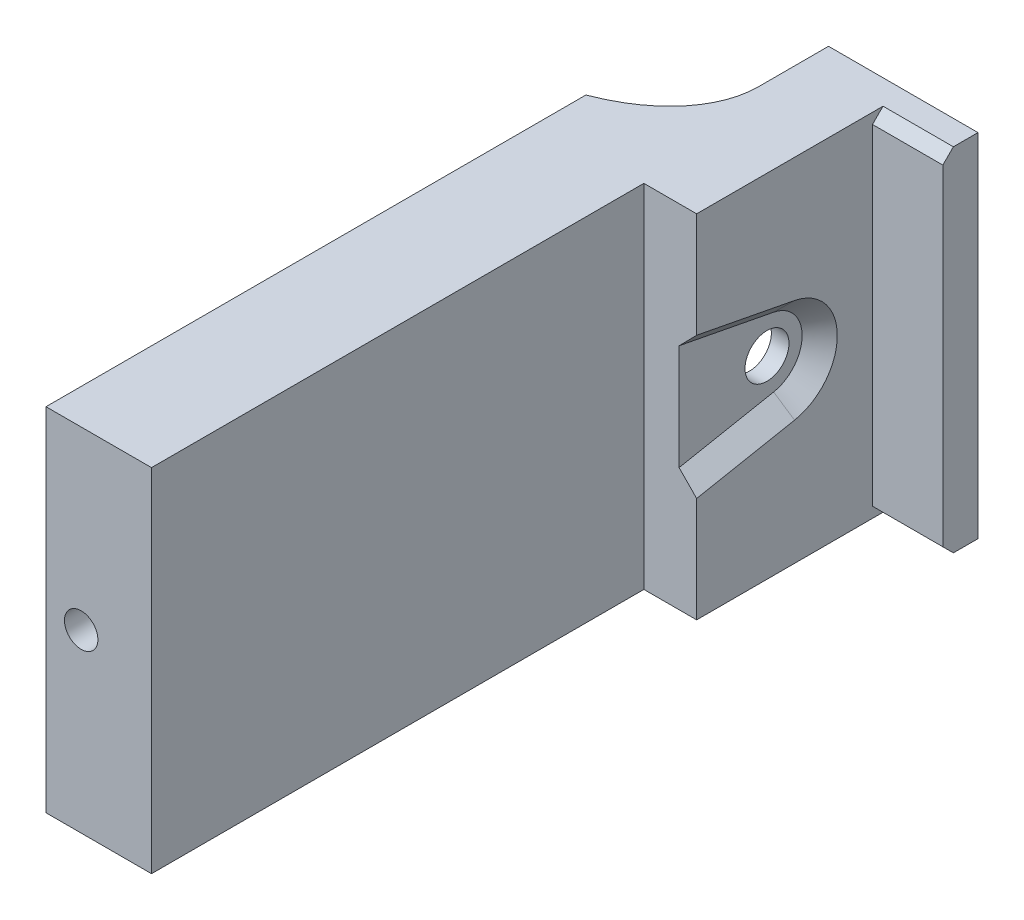
ISO-10303-21;
HEADER;
FILE_DESCRIPTION(('STEP AP214'),'2;1');
FILE_NAME('part.step','',(''),(''),'','','');
FILE_SCHEMA(('AUTOMOTIVE_DESIGN { 1 0 10303 214 1 1 1 1 }'));
ENDSEC;
DATA;
#1=APPLICATION_CONTEXT('core data for automotive mechanical design processes');
#2=APPLICATION_PROTOCOL_DEFINITION('international standard','automotive_design',2000,#1);
#3=PRODUCT_CONTEXT('',#1,'mechanical');
#4=PRODUCT('Part','Part','',(#3));
#5=PRODUCT_RELATED_PRODUCT_CATEGORY('part','',(#4));
#6=PRODUCT_DEFINITION_FORMATION('','',#4);
#7=PRODUCT_DEFINITION_CONTEXT('part definition',#1,'design');
#8=PRODUCT_DEFINITION('design','',#6,#7);
#9=PRODUCT_DEFINITION_SHAPE('','',#8);
#10=(LENGTH_UNIT() NAMED_UNIT(*) SI_UNIT(.MILLI.,.METRE.));
#11=(NAMED_UNIT(*) PLANE_ANGLE_UNIT() SI_UNIT($,.RADIAN.));
#12=(NAMED_UNIT(*) SI_UNIT($,.STERADIAN.) SOLID_ANGLE_UNIT());
#13=UNCERTAINTY_MEASURE_WITH_UNIT(LENGTH_MEASURE(1.E-05),#10,'distance_accuracy_value','');
#14=(GEOMETRIC_REPRESENTATION_CONTEXT(3) GLOBAL_UNCERTAINTY_ASSIGNED_CONTEXT((#13)) GLOBAL_UNIT_ASSIGNED_CONTEXT((#10,
#11,#12)) REPRESENTATION_CONTEXT('',''));
#15=CARTESIAN_POINT('',(0.,0.,0.));
#16=DIRECTION('',(0.,0.,1.));
#17=DIRECTION('',(1.,0.,0.));
#18=AXIS2_PLACEMENT_3D('',#15,#16,#17);
#19=CARTESIAN_POINT('',(16.,0.,-5.));
#20=DIRECTION('',(-1.,0.,0.));
#21=DIRECTION('',(0.,0.,1.));
#22=AXIS2_PLACEMENT_3D('',#19,#20,#21);
#23=CYLINDRICAL_SURFACE('',#22,1.25);
#24=CARTESIAN_POINT('',(1.00000000000001,0.,-5.));
#25=DIRECTION('',(-1.,0.,0.));
#26=DIRECTION('',(0.,0.,1.));
#27=AXIS2_PLACEMENT_3D('',#24,#25,#26);
#28=CIRCLE('',#27,1.25);
#29=CARTESIAN_POINT('',(1.00000000000001,0.,-3.75));
#30=VERTEX_POINT('',#29);
#31=EDGE_CURVE('E313',#30,#30,#28,.T.);
#32=ORIENTED_EDGE('',*,*,#31,.T.);
#33=EDGE_LOOP('',(#32));
#34=FACE_BOUND('',#33,.T.);
#35=CARTESIAN_POINT('',(2.,0.,-5.));
#36=DIRECTION('',(1.,0.,0.));
#37=DIRECTION('',(0.,0.,-1.));
#38=AXIS2_PLACEMENT_3D('',#35,#36,#37);
#39=CIRCLE('',#38,1.25);
#40=CARTESIAN_POINT('',(2.,0.,-6.25));
#41=VERTEX_POINT('',#40);
#42=EDGE_CURVE('E221',#41,#41,#39,.F.);
#43=ORIENTED_EDGE('',*,*,#42,.F.);
#44=EDGE_LOOP('',(#43));
#45=FACE_BOUND('',#44,.T.);
#46=ADVANCED_FACE('F37',(#34,#45),#23,.F.);
#47=CARTESIAN_POINT('',(0.999999999999999,10.,-10.));
#48=DIRECTION('',(1.,0.,0.));
#49=DIRECTION('',(0.,0.,-1.));
#50=AXIS2_PLACEMENT_3D('',#47,#48,#49);
#51=PLANE('',#50);
#52=ORIENTED_EDGE('',*,*,#31,.F.);
#53=EDGE_LOOP('',(#52));
#54=FACE_BOUND('',#53,.T.);
#55=DIRECTION('',(0.,0.,1.));
#56=VECTOR('',#55,1.);
#57=CARTESIAN_POINT('',(1.00000000000001,-7.50000000000003,-15.5355339059327));
#58=LINE('',#57,#56);
#59=CARTESIAN_POINT('',(1.,-7.50000000000004,-12.));
#60=VERTEX_POINT('',#59);
#61=CARTESIAN_POINT('',(1.00000000000001,-7.50000000000003,-8.));
#62=VERTEX_POINT('',#61);
#63=EDGE_CURVE('E373',#60,#62,#58,.T.);
#64=ORIENTED_EDGE('',*,*,#63,.T.);
#65=CARTESIAN_POINT('',(1.,0.985281374238492,-8.));
#66=DIRECTION('',(1.,0.,0.));
#67=DIRECTION('',(0.,-1.,0.));
#68=AXIS2_PLACEMENT_3D('',#65,#66,#67);
#69=ELLIPSE('',#68,8.48528137423853,6.);
#70=CARTESIAN_POINT('',(1.00000000000001,0.,-2.04058641250758));
#71=VERTEX_POINT('',#70);
#72=EDGE_CURVE('E249',#62,#71,#69,.F.);
#73=ORIENTED_EDGE('',*,*,#72,.T.);
#74=CARTESIAN_POINT('',(1.,-0.985281374238493,-8.));
#75=DIRECTION('',(1.,0.,0.));
#76=DIRECTION('',(0.,-1.,0.));
#77=AXIS2_PLACEMENT_3D('',#74,#75,#76);
#78=ELLIPSE('',#77,8.48528137423853,6.);
#79=CARTESIAN_POINT('',(1.00000000000001,7.50000000000003,-8.));
#80=VERTEX_POINT('',#79);
#81=EDGE_CURVE('E251',#71,#80,#78,.F.);
#82=ORIENTED_EDGE('',*,*,#81,.T.);
#83=DIRECTION('',(0.,0.,1.));
#84=VECTOR('',#83,1.);
#85=CARTESIAN_POINT('',(1.00000000000001,7.50000000000003,-15.5355339059327));
#86=LINE('',#85,#84);
#87=CARTESIAN_POINT('',(1.00000000000001,7.50000000000003,-12.));
#88=VERTEX_POINT('',#87);
#89=EDGE_CURVE('E364',#88,#80,#86,.T.);
#90=ORIENTED_EDGE('',*,*,#89,.F.);
#91=DIRECTION('',(0.,1.,0.));
#92=VECTOR('',#91,1.);
#93=CARTESIAN_POINT('',(1.,10.,-12.));
#94=LINE('',#93,#92);
#95=EDGE_CURVE('E356',#60,#88,#94,.T.);
#96=ORIENTED_EDGE('',*,*,#95,.F.);
#97=EDGE_LOOP('',(#64,#73,#82,#90,#96));
#98=FACE_BOUND('',#97,.T.);
#99=ADVANCED_FACE('F451',(#54,#98),#51,.F.);
#100=CARTESIAN_POINT('',(1.00000000000001,10.,-2.));
#101=DIRECTION('',(0.,0.,1.));
#102=DIRECTION('',(1.,0.,0.));
#103=AXIS2_PLACEMENT_3D('',#100,#101,#102);
#104=PLANE('',#103);
#105=DIRECTION('',(-0.707106781186551,0.707106781186544,0.));
#106=VECTOR('',#105,1.);
#107=CARTESIAN_POINT('',(-3.24264068711925,3.25735931288072,-2.));
#108=LINE('',#107,#106);
#109=CARTESIAN_POINT('',(-1.99999999999999,2.01471862576147,-2.));
#110=VERTEX_POINT('',#109);
#111=CARTESIAN_POINT('',(0.0147186257614998,0.,-2.));
#112=VERTEX_POINT('',#111);
#113=EDGE_CURVE('E247',#110,#112,#108,.F.);
#114=ORIENTED_EDGE('',*,*,#113,.T.);
#115=DIRECTION('',(0.707106781186551,0.707106781186544,0.));
#116=VECTOR('',#115,1.);
#117=CARTESIAN_POINT('',(-5.74264068711925,-5.75735931288069,-2.));
#118=LINE('',#117,#116);
#119=CARTESIAN_POINT('',(-1.99999999999999,-2.01471862576147,-2.));
#120=VERTEX_POINT('',#119);
#121=EDGE_CURVE('E245',#112,#120,#118,.F.);
#122=ORIENTED_EDGE('',*,*,#121,.T.);
#123=DIRECTION('',(0.,-1.,0.));
#124=VECTOR('',#123,1.);
#125=CARTESIAN_POINT('',(-1.99999999999999,10.,-2.));
#126=LINE('',#125,#124);
#127=EDGE_CURVE('E284',#110,#120,#126,.T.);
#128=ORIENTED_EDGE('',*,*,#127,.F.);
#129=EDGE_LOOP('',(#114,#122,#128));
#130=FACE_BOUND('',#129,.T.);
#131=ADVANCED_FACE('F481',(#130),#104,.F.);
#132=CARTESIAN_POINT('',(-1.99999999999999,10.,-2.));
#133=DIRECTION('',(1.,0.,0.));
#134=DIRECTION('',(0.,0.,-1.));
#135=AXIS2_PLACEMENT_3D('',#132,#133,#134);
#136=PLANE('',#135);
#137=DIRECTION('',(0.,0.,1.));
#138=VECTOR('',#137,1.);
#139=CARTESIAN_POINT('',(-2.,-5.99999999999996,-7.65685424949242));
#140=LINE('',#139,#138);
#141=CARTESIAN_POINT('',(-2.,-5.99999999999996,-2.70294740595547));
#142=VERTEX_POINT('',#141);
#143=CARTESIAN_POINT('',(-2.,-5.99999999999996,26.));
#144=VERTEX_POINT('',#143);
#145=EDGE_CURVE('E338',#142,#144,#140,.T.);
#146=ORIENTED_EDGE('',*,*,#145,.T.);
#147=DIRECTION('',(0.,-1.,0.));
#148=VECTOR('',#147,1.);
#149=CARTESIAN_POINT('',(-2.,10.,26.));
#150=LINE('',#149,#148);
#151=CARTESIAN_POINT('',(-2.,5.99999999999996,26.));
#152=VERTEX_POINT('',#151);
#153=EDGE_CURVE('E287',#152,#144,#150,.T.);
#154=ORIENTED_EDGE('',*,*,#153,.F.);
#155=DIRECTION('',(0.,0.,1.));
#156=VECTOR('',#155,1.);
#157=CARTESIAN_POINT('',(-2.,5.99999999999996,-7.65685424949242));
#158=LINE('',#157,#156);
#159=CARTESIAN_POINT('',(-2.,5.99999999999996,-2.70294740595547));
#160=VERTEX_POINT('',#159);
#161=EDGE_CURVE('E331',#160,#152,#158,.T.);
#162=ORIENTED_EDGE('',*,*,#161,.F.);
#163=CARTESIAN_POINT('',(-1.99999999999999,2.01471862576147,-8.));
#164=DIRECTION('',(1.,0.,0.));
#165=DIRECTION('',(0.,-1.,0.));
#166=AXIS2_PLACEMENT_3D('',#163,#164,#165);
#167=ELLIPSE('',#166,8.48528137423853,6.);
#168=EDGE_CURVE('E220',#160,#110,#167,.T.);
#169=ORIENTED_EDGE('',*,*,#168,.T.);
#170=ORIENTED_EDGE('',*,*,#127,.T.);
#171=CARTESIAN_POINT('',(-1.99999999999999,-2.01471862576147,-8.));
#172=DIRECTION('',(1.,0.,0.));
#173=DIRECTION('',(0.,-1.,0.));
#174=AXIS2_PLACEMENT_3D('',#171,#172,#173);
#175=ELLIPSE('',#174,8.48528137423853,6.);
#176=EDGE_CURVE('E240',#120,#142,#175,.T.);
#177=ORIENTED_EDGE('',*,*,#176,.T.);
#178=EDGE_LOOP('',(#146,#154,#162,#169,#170,#177));
#179=FACE_BOUND('',#178,.T.);
#180=ADVANCED_FACE('F500',(#179),#136,.F.);
#181=CARTESIAN_POINT('',(-2.,10.,26.));
#182=DIRECTION('',(0.,0.,1.));
#183=DIRECTION('',(1.,0.,0.));
#184=AXIS2_PLACEMENT_3D('',#181,#182,#183);
#185=PLANE('',#184);
#186=CARTESIAN_POINT('',(-4.,0.,26.));
#187=DIRECTION('',(0.,0.,1.));
#188=DIRECTION('',(1.,0.,0.));
#189=AXIS2_PLACEMENT_3D('',#186,#187,#188);
#190=CIRCLE('',#189,0.95);
#191=CARTESIAN_POINT('',(-3.05,0.,26.));
#192=VERTEX_POINT('',#191);
#193=EDGE_CURVE('E325',#192,#192,#190,.T.);
#194=ORIENTED_EDGE('',*,*,#193,.T.);
#195=EDGE_LOOP('',(#194));
#196=FACE_BOUND('',#195,.T.);
#197=DIRECTION('',(0.707106781186544,0.707106781186551,0.));
#198=VECTOR('',#197,1.);
#199=CARTESIAN_POINT('',(-6.,-10.,26.));
#200=LINE('',#199,#198);
#201=CARTESIAN_POINT('',(-6.,-10.,26.));
#202=VERTEX_POINT('',#201);
#203=EDGE_CURVE('E343',#202,#144,#200,.T.);
#204=ORIENTED_EDGE('',*,*,#203,.F.);
#205=DIRECTION('',(0.,-1.,0.));
#206=VECTOR('',#205,1.);
#207=CARTESIAN_POINT('',(-6.,10.,26.));
#208=LINE('',#207,#206);
#209=CARTESIAN_POINT('',(-6.,10.,26.));
#210=VERTEX_POINT('',#209);
#211=EDGE_CURVE('E290',#210,#202,#208,.T.);
#212=ORIENTED_EDGE('',*,*,#211,.F.);
#213=DIRECTION('',(-0.707106781186544,0.707106781186551,0.));
#214=VECTOR('',#213,1.);
#215=CARTESIAN_POINT('',(-6.,10.,26.));
#216=LINE('',#215,#214);
#217=EDGE_CURVE('E335',#152,#210,#216,.T.);
#218=ORIENTED_EDGE('',*,*,#217,.F.);
#219=ORIENTED_EDGE('',*,*,#153,.T.);
#220=EDGE_LOOP('',(#204,#212,#218,#219));
#221=FACE_BOUND('',#220,.T.);
#222=ADVANCED_FACE('F434',(#196,#221),#185,.F.);
#223=CARTESIAN_POINT('',(0.,10.,28.));
#224=DIRECTION('',(-1.,0.,0.));
#225=DIRECTION('',(0.,0.,1.));
#226=AXIS2_PLACEMENT_3D('',#223,#224,#225);
#227=PLANE('',#226);
#228=DIRECTION('',(0.,0.,-1.));
#229=VECTOR('',#228,1.);
#230=CARTESIAN_POINT('',(0.,-10.,28.));
#231=LINE('',#230,#229);
#232=CARTESIAN_POINT('',(0.,-10.,28.));
#233=VERTEX_POINT('',#232);
#234=CARTESIAN_POINT('',(0.,-10.,0.));
#235=VERTEX_POINT('',#234);
#236=EDGE_CURVE('E310',#233,#235,#231,.T.);
#237=ORIENTED_EDGE('',*,*,#236,.T.);
#238=DIRECTION('',(0.,-1.,0.));
#239=VECTOR('',#238,1.);
#240=CARTESIAN_POINT('',(0.,10.,0.));
#241=LINE('',#240,#239);
#242=CARTESIAN_POINT('',(0.,10.,0.));
#243=VERTEX_POINT('',#242);
#244=EDGE_CURVE('E275',#243,#235,#241,.T.);
#245=ORIENTED_EDGE('',*,*,#244,.F.);
#246=DIRECTION('',(0.,0.,-1.));
#247=VECTOR('',#246,1.);
#248=CARTESIAN_POINT('',(0.,10.,28.));
#249=LINE('',#248,#247);
#250=CARTESIAN_POINT('',(0.,10.,28.));
#251=VERTEX_POINT('',#250);
#252=EDGE_CURVE('E302',#251,#243,#249,.T.);
#253=ORIENTED_EDGE('',*,*,#252,.F.);
#254=DIRECTION('',(0.,-1.,0.));
#255=VECTOR('',#254,1.);
#256=CARTESIAN_POINT('',(0.,10.,28.));
#257=LINE('',#256,#255);
#258=EDGE_CURVE('E296',#251,#233,#257,.T.);
#259=ORIENTED_EDGE('',*,*,#258,.T.);
#260=EDGE_LOOP('',(#237,#245,#253,#259));
#261=FACE_BOUND('',#260,.T.);
#262=ADVANCED_FACE('F420',(#261),#227,.F.);
#263=CARTESIAN_POINT('',(0.,10.,0.));
#264=DIRECTION('',(0.,0.,-1.));
#265=DIRECTION('',(-1.,0.,0.));
#266=AXIS2_PLACEMENT_3D('',#263,#264,#265);
#267=PLANE('',#266);
#268=DIRECTION('',(0.,-1.,0.));
#269=VECTOR('',#268,1.);
#270=CARTESIAN_POINT('',(3.00000000000001,10.,0.));
#271=LINE('',#270,#269);
#272=CARTESIAN_POINT('',(3.00000000000001,-4.01838704167898,0.));
#273=VERTEX_POINT('',#272);
#274=CARTESIAN_POINT('',(3.00000000000001,-10.,0.));
#275=VERTEX_POINT('',#274);
#276=EDGE_CURVE('E280',#273,#275,#271,.T.);
#277=ORIENTED_EDGE('',*,*,#276,.F.);
#278=DIRECTION('',(0.700636129498533,-0.713518755213424,0.));
#279=VECTOR('',#278,1.);
#280=CARTESIAN_POINT('',(2.00000000000001,-3.,0.));
#281=LINE('',#280,#279);
#282=CARTESIAN_POINT('',(2.00000000000001,-3.,0.));
#283=VERTEX_POINT('',#282);
#284=EDGE_CURVE('E11',#273,#283,#281,.F.);
#285=ORIENTED_EDGE('',*,*,#284,.T.);
#286=DIRECTION('',(0.,-1.,0.));
#287=VECTOR('',#286,1.);
#288=CARTESIAN_POINT('',(2.00000000000001,-3.,0.));
#289=LINE('',#288,#287);
#290=CARTESIAN_POINT('',(2.00000000000001,3.,0.));
#291=VERTEX_POINT('',#290);
#292=EDGE_CURVE('E209',#291,#283,#289,.T.);
#293=ORIENTED_EDGE('',*,*,#292,.F.);
#294=DIRECTION('',(-0.700636129498533,-0.713518755213424,0.));
#295=VECTOR('',#294,1.);
#296=CARTESIAN_POINT('',(2.00000000000001,3.,0.));
#297=LINE('',#296,#295);
#298=CARTESIAN_POINT('',(3.00000000000001,4.01838704167898,0.));
#299=VERTEX_POINT('',#298);
#300=EDGE_CURVE('E47',#291,#299,#297,.F.);
#301=ORIENTED_EDGE('',*,*,#300,.T.);
#302=CARTESIAN_POINT('',(3.00000000000001,10.,0.));
#303=VERTEX_POINT('',#302);
#304=EDGE_CURVE('E278',#303,#299,#271,.T.);
#305=ORIENTED_EDGE('',*,*,#304,.F.);
#306=DIRECTION('',(1.,0.,0.));
#307=VECTOR('',#306,1.);
#308=CARTESIAN_POINT('',(0.,10.,0.));
#309=LINE('',#308,#307);
#310=EDGE_CURVE('E319',#243,#303,#309,.T.);
#311=ORIENTED_EDGE('',*,*,#310,.F.);
#312=ORIENTED_EDGE('',*,*,#244,.T.);
#313=DIRECTION('',(1.,0.,0.));
#314=VECTOR('',#313,1.);
#315=CARTESIAN_POINT('',(0.,-10.,0.));
#316=LINE('',#315,#314);
#317=EDGE_CURVE('E307',#235,#275,#316,.T.);
#318=ORIENTED_EDGE('',*,*,#317,.T.);
#319=EDGE_LOOP('',(#277,#285,#293,#301,#305,#311,#312,#318));
#320=FACE_BOUND('',#319,.T.);
#321=ADVANCED_FACE('F385',(#320),#267,.F.);
#322=CARTESIAN_POINT('',(3.00000000000001,10.,0.));
#323=DIRECTION('',(-1.,0.,0.));
#324=DIRECTION('',(0.,0.,1.));
#325=AXIS2_PLACEMENT_3D('',#322,#323,#324);
#326=PLANE('',#325);
#327=CARTESIAN_POINT('',(3.,0.,-5.));
#328=DIRECTION('',(-1.,0.,0.));
#329=DIRECTION('',(0.,0.,1.));
#330=AXIS2_PLACEMENT_3D('',#327,#328,#329);
#331=CIRCLE('',#330,3.00000000000001);
#332=CARTESIAN_POINT('',(3.,2.94583481252281,-5.56750088751368));
#333=VERTEX_POINT('',#332);
#334=CARTESIAN_POINT('',(3.,-2.94583481252281,-5.56750088751368));
#335=VERTEX_POINT('',#334);
#336=EDGE_CURVE('E55',#333,#335,#331,.T.);
#337=ORIENTED_EDGE('',*,*,#336,.T.);
#338=DIRECTION('',(0.,-0.189166962504559,0.981944937507597));
#339=VECTOR('',#338,1.);
#340=CARTESIAN_POINT('',(3.00000000000001,-3.516751121366,-2.60393699778009));
#341=LINE('',#340,#339);
#342=EDGE_CURVE('E216',#335,#273,#341,.T.);
#343=ORIENTED_EDGE('',*,*,#342,.T.);
#344=ORIENTED_EDGE('',*,*,#276,.T.);
#345=DIRECTION('',(0.,0.,-1.));
#346=VECTOR('',#345,1.);
#347=CARTESIAN_POINT('',(3.00000000000001,-10.,0.));
#348=LINE('',#347,#346);
#349=CARTESIAN_POINT('',(3.,-10.,-10.6));
#350=VERTEX_POINT('',#349);
#351=EDGE_CURVE('E305',#275,#350,#348,.T.);
#352=ORIENTED_EDGE('',*,*,#351,.T.);
#353=DIRECTION('',(0.,-0.707106781186548,-0.707106781186548));
#354=VECTOR('',#353,1.);
#355=CARTESIAN_POINT('',(3.00000000000001,5.3,4.7));
#356=LINE('',#355,#354);
#357=CARTESIAN_POINT('',(3.,-9.39999999999999,-10.));
#358=VERTEX_POINT('',#357);
#359=EDGE_CURVE('E259',#350,#358,#356,.F.);
#360=ORIENTED_EDGE('',*,*,#359,.T.);
#361=DIRECTION('',(0.,-1.,0.));
#362=VECTOR('',#361,1.);
#363=CARTESIAN_POINT('',(3.,10.,-10.));
#364=LINE('',#363,#362);
#365=CARTESIAN_POINT('',(3.,9.39999999999999,-10.));
#366=VERTEX_POINT('',#365);
#367=EDGE_CURVE('E281',#366,#358,#364,.T.);
#368=ORIENTED_EDGE('',*,*,#367,.F.);
#369=DIRECTION('',(0.,0.707106781186548,-0.707106781186548));
#370=VECTOR('',#369,1.);
#371=CARTESIAN_POINT('',(3.,4.7,-5.3));
#372=LINE('',#371,#370);
#373=CARTESIAN_POINT('',(3.,10.,-10.6));
#374=VERTEX_POINT('',#373);
#375=EDGE_CURVE('E256',#366,#374,#372,.T.);
#376=ORIENTED_EDGE('',*,*,#375,.T.);
#377=DIRECTION('',(0.,0.,-1.));
#378=VECTOR('',#377,1.);
#379=CARTESIAN_POINT('',(3.00000000000001,10.,0.));
#380=LINE('',#379,#378);
#381=EDGE_CURVE('E317',#303,#374,#380,.T.);
#382=ORIENTED_EDGE('',*,*,#381,.F.);
#383=ORIENTED_EDGE('',*,*,#304,.T.);
#384=DIRECTION('',(0.,-0.189166962504559,-0.981944937507597));
#385=VECTOR('',#384,1.);
#386=CARTESIAN_POINT('',(3.00000000000001,4.23243391543002,1.11109382572072));
#387=LINE('',#386,#385);
#388=EDGE_CURVE('E60',#299,#333,#387,.T.);
#389=ORIENTED_EDGE('',*,*,#388,.T.);
#390=EDGE_LOOP('',(#337,#343,#344,#352,#360,#368,#376,#382,#383,#389));
#391=FACE_BOUND('',#390,.T.);
#392=ADVANCED_FACE('F387',(#391),#326,.F.);
#393=CARTESIAN_POINT('',(-6.,10.,26.));
#394=DIRECTION('',(1.,0.,0.));
#395=DIRECTION('',(0.,0.,-1.));
#396=AXIS2_PLACEMENT_3D('',#393,#394,#395);
#397=PLANE('',#396);
#398=DIRECTION('',(0.,0.,1.));
#399=VECTOR('',#398,1.);
#400=CARTESIAN_POINT('',(-6.,-10.,26.));
#401=LINE('',#400,#399);
#402=CARTESIAN_POINT('',(-6.,-10.,28.));
#403=VERTEX_POINT('',#402);
#404=EDGE_CURVE('E303',#202,#403,#401,.T.);
#405=ORIENTED_EDGE('',*,*,#404,.T.);
#406=DIRECTION('',(0.,-1.,0.));
#407=VECTOR('',#406,1.);
#408=CARTESIAN_POINT('',(-6.,10.,28.));
#409=LINE('',#408,#407);
#410=CARTESIAN_POINT('',(-6.,10.,28.));
#411=VERTEX_POINT('',#410);
#412=EDGE_CURVE('E293',#411,#403,#409,.T.);
#413=ORIENTED_EDGE('',*,*,#412,.F.);
#414=DIRECTION('',(0.,0.,1.));
#415=VECTOR('',#414,1.);
#416=CARTESIAN_POINT('',(-6.,10.,26.));
#417=LINE('',#416,#415);
#418=EDGE_CURVE('E315',#210,#411,#417,.T.);
#419=ORIENTED_EDGE('',*,*,#418,.F.);
#420=ORIENTED_EDGE('',*,*,#211,.T.);
#421=EDGE_LOOP('',(#405,#413,#419,#420));
#422=FACE_BOUND('',#421,.T.);
#423=ADVANCED_FACE('F430',(#422),#397,.F.);
#424=CARTESIAN_POINT('',(-6.,10.,28.));
#425=DIRECTION('',(0.,0.,-1.));
#426=DIRECTION('',(-1.,0.,0.));
#427=AXIS2_PLACEMENT_3D('',#424,#425,#426);
#428=PLANE('',#427);
#429=CARTESIAN_POINT('',(-4.,0.,28.));
#430=DIRECTION('',(0.,0.,1.));
#431=DIRECTION('',(1.,0.,0.));
#432=AXIS2_PLACEMENT_3D('',#429,#430,#431);
#433=CIRCLE('',#432,0.95);
#434=CARTESIAN_POINT('',(-3.05,0.,28.));
#435=VERTEX_POINT('',#434);
#436=EDGE_CURVE('E328',#435,#435,#433,.T.);
#437=ORIENTED_EDGE('',*,*,#436,.F.);
#438=EDGE_LOOP('',(#437));
#439=FACE_BOUND('',#438,.T.);
#440=DIRECTION('',(1.,0.,0.));
#441=VECTOR('',#440,1.);
#442=CARTESIAN_POINT('',(-6.,-10.,28.));
#443=LINE('',#442,#441);
#444=EDGE_CURVE('E300',#403,#233,#443,.T.);
#445=ORIENTED_EDGE('',*,*,#444,.T.);
#446=ORIENTED_EDGE('',*,*,#258,.F.);
#447=DIRECTION('',(1.,0.,0.));
#448=VECTOR('',#447,1.);
#449=CARTESIAN_POINT('',(-6.,10.,28.));
#450=LINE('',#449,#448);
#451=EDGE_CURVE('E299',#411,#251,#450,.T.);
#452=ORIENTED_EDGE('',*,*,#451,.F.);
#453=ORIENTED_EDGE('',*,*,#412,.T.);
#454=EDGE_LOOP('',(#445,#446,#452,#453));
#455=FACE_BOUND('',#454,.T.);
#456=ADVANCED_FACE('F425',(#439,#455),#428,.F.);
#457=CARTESIAN_POINT('',(0.,10.,0.));
#458=DIRECTION('',(0.,-1.,0.));
#459=DIRECTION('',(0.,0.,-1.));
#460=AXIS2_PLACEMENT_3D('',#457,#458,#459);
#461=PLANE('',#460);
#462=DIRECTION('',(0.,0.,1.));
#463=VECTOR('',#462,1.);
#464=CARTESIAN_POINT('',(-1.49999999999999,10.,-15.5355339059327));
#465=LINE('',#464,#463);
#466=CARTESIAN_POINT('',(-1.49999999999999,10.,-12.));
#467=VERTEX_POINT('',#466);
#468=CARTESIAN_POINT('',(-1.49999999999999,10.,-8.));
#469=VERTEX_POINT('',#468);
#470=EDGE_CURVE('E367',#467,#469,#465,.T.);
#471=ORIENTED_EDGE('',*,*,#470,.T.);
#472=CARTESIAN_POINT('',(-9.9852813742386,10.,-8.));
#473=DIRECTION('',(0.,-1.,0.));
#474=DIRECTION('',(1.,0.,0.));
#475=AXIS2_PLACEMENT_3D('',#472,#473,#474);
#476=ELLIPSE('',#475,8.48528137423861,6.);
#477=CARTESIAN_POINT('',(-6.,10.,-2.70294740595551));
#478=VERTEX_POINT('',#477);
#479=EDGE_CURVE('E232',#469,#478,#476,.T.);
#480=ORIENTED_EDGE('',*,*,#479,.T.);
#481=DIRECTION('',(0.,0.,1.));
#482=VECTOR('',#481,1.);
#483=CARTESIAN_POINT('',(-6.,10.,-7.65685424949242));
#484=LINE('',#483,#482);
#485=EDGE_CURVE('E333',#478,#210,#484,.T.);
#486=ORIENTED_EDGE('',*,*,#485,.T.);
#487=ORIENTED_EDGE('',*,*,#418,.T.);
#488=ORIENTED_EDGE('',*,*,#451,.T.);
#489=ORIENTED_EDGE('',*,*,#252,.T.);
#490=ORIENTED_EDGE('',*,*,#310,.T.);
#491=ORIENTED_EDGE('',*,*,#381,.T.);
#492=DIRECTION('',(1.,0.,0.));
#493=VECTOR('',#492,1.);
#494=CARTESIAN_POINT('',(7.,10.,-10.6));
#495=LINE('',#494,#493);
#496=CARTESIAN_POINT('',(7.,10.,-10.6));
#497=VERTEX_POINT('',#496);
#498=EDGE_CURVE('E261',#374,#497,#495,.T.);
#499=ORIENTED_EDGE('',*,*,#498,.T.);
#500=DIRECTION('',(0.,0.,1.));
#501=VECTOR('',#500,1.);
#502=CARTESIAN_POINT('',(7.,10.,-12.));
#503=LINE('',#502,#501);
#504=CARTESIAN_POINT('',(7.,10.,-12.));
#505=VERTEX_POINT('',#504);
#506=EDGE_CURVE('E346',#505,#497,#503,.T.);
#507=ORIENTED_EDGE('',*,*,#506,.F.);
#508=DIRECTION('',(1.,0.,0.));
#509=VECTOR('',#508,1.);
#510=CARTESIAN_POINT('',(1.,10.,-12.));
#511=LINE('',#510,#509);
#512=EDGE_CURVE('E361',#467,#505,#511,.T.);
#513=ORIENTED_EDGE('',*,*,#512,.F.);
#514=EDGE_LOOP('',(#471,#480,#486,#487,#488,#489,#490,#491,#499,#507,#513));
#515=FACE_BOUND('',#514,.T.);
#516=ADVANCED_FACE('F414',(#515),#461,.F.);
#517=CARTESIAN_POINT('',(0.,-10.,0.));
#518=DIRECTION('',(0.,-1.,0.));
#519=DIRECTION('',(0.,0.,-1.));
#520=AXIS2_PLACEMENT_3D('',#517,#518,#519);
#521=PLANE('',#520);
#522=DIRECTION('',(0.,0.,1.));
#523=VECTOR('',#522,1.);
#524=CARTESIAN_POINT('',(-6.,-10.,-7.65685424949242));
#525=LINE('',#524,#523);
#526=CARTESIAN_POINT('',(-6.,-10.,-2.70294740595551));
#527=VERTEX_POINT('',#526);
#528=EDGE_CURVE('E340',#527,#202,#525,.T.);
#529=ORIENTED_EDGE('',*,*,#528,.F.);
#530=CARTESIAN_POINT('',(-9.98528137423861,-10.,-8.));
#531=DIRECTION('',(0.,-1.,0.));
#532=DIRECTION('',(-1.,0.,0.));
#533=AXIS2_PLACEMENT_3D('',#530,#531,#532);
#534=ELLIPSE('',#533,8.48528137423861,6.);
#535=CARTESIAN_POINT('',(-1.49999999999999,-10.,-8.));
#536=VERTEX_POINT('',#535);
#537=EDGE_CURVE('E235',#527,#536,#534,.F.);
#538=ORIENTED_EDGE('',*,*,#537,.T.);
#539=DIRECTION('',(0.,0.,1.));
#540=VECTOR('',#539,1.);
#541=CARTESIAN_POINT('',(-1.49999999999999,-10.,-15.5355339059327));
#542=LINE('',#541,#540);
#543=CARTESIAN_POINT('',(-1.49999999999999,-10.,-12.));
#544=VERTEX_POINT('',#543);
#545=EDGE_CURVE('E227',#544,#536,#542,.T.);
#546=ORIENTED_EDGE('',*,*,#545,.F.);
#547=DIRECTION('',(-1.,0.,0.));
#548=VECTOR('',#547,1.);
#549=CARTESIAN_POINT('',(1.,-10.,-12.));
#550=LINE('',#549,#548);
#551=CARTESIAN_POINT('',(7.,-10.,-12.));
#552=VERTEX_POINT('',#551);
#553=EDGE_CURVE('E352',#552,#544,#550,.T.);
#554=ORIENTED_EDGE('',*,*,#553,.F.);
#555=DIRECTION('',(0.,0.,1.));
#556=VECTOR('',#555,1.);
#557=CARTESIAN_POINT('',(7.,-10.,-12.));
#558=LINE('',#557,#556);
#559=CARTESIAN_POINT('',(7.,-10.,-10.6));
#560=VERTEX_POINT('',#559);
#561=EDGE_CURVE('E349',#552,#560,#558,.T.);
#562=ORIENTED_EDGE('',*,*,#561,.T.);
#563=DIRECTION('',(-1.,0.,0.));
#564=VECTOR('',#563,1.);
#565=CARTESIAN_POINT('',(0.,-10.,-10.6));
#566=LINE('',#565,#564);
#567=EDGE_CURVE('E272',#560,#350,#566,.T.);
#568=ORIENTED_EDGE('',*,*,#567,.T.);
#569=ORIENTED_EDGE('',*,*,#351,.F.);
#570=ORIENTED_EDGE('',*,*,#317,.F.);
#571=ORIENTED_EDGE('',*,*,#236,.F.);
#572=ORIENTED_EDGE('',*,*,#444,.F.);
#573=ORIENTED_EDGE('',*,*,#404,.F.);
#574=EDGE_LOOP('',(#529,#538,#546,#554,#562,#568,#569,#570,#571,#572,#573));
#575=FACE_BOUND('',#574,.T.);
#576=ADVANCED_FACE('F396',(#575),#521,.T.);
#577=CARTESIAN_POINT('',(-4.,0.,-10.));
#578=DIRECTION('',(0.,0.,1.));
#579=DIRECTION('',(1.,0.,0.));
#580=AXIS2_PLACEMENT_3D('',#577,#578,#579);
#581=CYLINDRICAL_SURFACE('',#580,0.95);
#582=ORIENTED_EDGE('',*,*,#436,.T.);
#583=EDGE_LOOP('',(#582));
#584=FACE_BOUND('',#583,.T.);
#585=ORIENTED_EDGE('',*,*,#193,.F.);
#586=EDGE_LOOP('',(#585));
#587=FACE_BOUND('',#586,.T.);
#588=ADVANCED_FACE('F487',(#584,#587),#581,.F.);
#589=CARTESIAN_POINT('',(-6.,10.,-7.65685424949242));
#590=DIRECTION('',(0.707106781186551,0.707106781186544,0.));
#591=DIRECTION('',(-0.707106781186544,0.707106781186551,0.));
#592=AXIS2_PLACEMENT_3D('',#589,#590,#591);
#593=PLANE('',#592);
#594=ORIENTED_EDGE('',*,*,#485,.F.);
#595=DIRECTION('',(0.707106781186551,-0.707106781186544,0.));
#596=VECTOR('',#595,1.);
#597=CARTESIAN_POINT('',(-6.,10.,-2.70294740595551));
#598=LINE('',#597,#596);
#599=EDGE_CURVE('E229',#478,#160,#598,.T.);
#600=ORIENTED_EDGE('',*,*,#599,.T.);
#601=ORIENTED_EDGE('',*,*,#161,.T.);
#602=ORIENTED_EDGE('',*,*,#217,.T.);
#603=EDGE_LOOP('',(#594,#600,#601,#602));
#604=FACE_BOUND('',#603,.T.);
#605=ADVANCED_FACE('F629',(#604),#593,.F.);
#606=CARTESIAN_POINT('',(-6.,-10.,-7.65685424949242));
#607=DIRECTION('',(0.707106781186551,-0.707106781186544,0.));
#608=DIRECTION('',(0.707106781186544,0.707106781186551,0.));
#609=AXIS2_PLACEMENT_3D('',#606,#607,#608);
#610=PLANE('',#609);
#611=ORIENTED_EDGE('',*,*,#145,.F.);
#612=DIRECTION('',(-0.707106781186551,-0.707106781186544,0.));
#613=VECTOR('',#612,1.);
#614=CARTESIAN_POINT('',(-1.99999999999999,-5.99999999999995,-2.70294740595547));
#615=LINE('',#614,#613);
#616=EDGE_CURVE('E237',#142,#527,#615,.T.);
#617=ORIENTED_EDGE('',*,*,#616,.T.);
#618=ORIENTED_EDGE('',*,*,#528,.T.);
#619=ORIENTED_EDGE('',*,*,#203,.T.);
#620=EDGE_LOOP('',(#611,#617,#618,#619));
#621=FACE_BOUND('',#620,.T.);
#622=ADVANCED_FACE('F437',(#621),#610,.F.);
#623=CARTESIAN_POINT('',(7.,10.,-12.));
#624=DIRECTION('',(-1.,0.,0.));
#625=DIRECTION('',(0.,0.,1.));
#626=AXIS2_PLACEMENT_3D('',#623,#624,#625);
#627=PLANE('',#626);
#628=DIRECTION('',(0.,-1.,0.));
#629=VECTOR('',#628,1.);
#630=CARTESIAN_POINT('',(7.,10.,-9.99999999999999));
#631=LINE('',#630,#629);
#632=CARTESIAN_POINT('',(7.,9.39999999999999,-9.99999999999999));
#633=VERTEX_POINT('',#632);
#634=CARTESIAN_POINT('',(7.,-9.39999999999999,-9.99999999999999));
#635=VERTEX_POINT('',#634);
#636=EDGE_CURVE('E353',#633,#635,#631,.T.);
#637=ORIENTED_EDGE('',*,*,#636,.T.);
#638=DIRECTION('',(0.,0.707106781186548,0.707106781186548));
#639=VECTOR('',#638,1.);
#640=CARTESIAN_POINT('',(7.,-10.,-10.6));
#641=LINE('',#640,#639);
#642=EDGE_CURVE('E264',#635,#560,#641,.F.);
#643=ORIENTED_EDGE('',*,*,#642,.T.);
#644=ORIENTED_EDGE('',*,*,#561,.F.);
#645=DIRECTION('',(0.,-1.,0.));
#646=VECTOR('',#645,1.);
#647=CARTESIAN_POINT('',(7.,10.,-12.));
#648=LINE('',#647,#646);
#649=EDGE_CURVE('E359',#505,#552,#648,.T.);
#650=ORIENTED_EDGE('',*,*,#649,.F.);
#651=ORIENTED_EDGE('',*,*,#506,.T.);
#652=DIRECTION('',(0.,-0.707106781186548,0.707106781186548));
#653=VECTOR('',#652,1.);
#654=CARTESIAN_POINT('',(7.,10.,-10.6));
#655=LINE('',#654,#653);
#656=EDGE_CURVE('E266',#497,#633,#655,.T.);
#657=ORIENTED_EDGE('',*,*,#656,.T.);
#658=EDGE_LOOP('',(#637,#643,#644,#650,#651,#657));
#659=FACE_BOUND('',#658,.T.);
#660=ADVANCED_FACE('F402',(#659),#627,.F.);
#661=CARTESIAN_POINT('',(0.,0.,-12.));
#662=DIRECTION('',(0.,0.,1.));
#663=DIRECTION('',(1.,0.,0.));
#664=AXIS2_PLACEMENT_3D('',#661,#662,#663);
#665=PLANE('',#664);
#666=ORIENTED_EDGE('',*,*,#553,.T.);
#667=DIRECTION('',(-0.707106781186551,-0.707106781186544,0.));
#668=VECTOR('',#667,1.);
#669=CARTESIAN_POINT('',(-1.49999999999999,-10.,-12.));
#670=LINE('',#669,#668);
#671=EDGE_CURVE('E370',#60,#544,#670,.T.);
#672=ORIENTED_EDGE('',*,*,#671,.F.);
#673=ORIENTED_EDGE('',*,*,#95,.T.);
#674=DIRECTION('',(0.707106781186551,-0.707106781186544,0.));
#675=VECTOR('',#674,1.);
#676=CARTESIAN_POINT('',(-1.49999999999999,10.,-12.));
#677=LINE('',#676,#675);
#678=EDGE_CURVE('E357',#467,#88,#677,.T.);
#679=ORIENTED_EDGE('',*,*,#678,.F.);
#680=ORIENTED_EDGE('',*,*,#512,.T.);
#681=ORIENTED_EDGE('',*,*,#649,.T.);
#682=EDGE_LOOP('',(#666,#672,#673,#679,#680,#681));
#683=FACE_BOUND('',#682,.T.);
#684=ADVANCED_FACE('F465',(#683),#665,.F.);
#685=CARTESIAN_POINT('',(0.,0.,-10.));
#686=DIRECTION('',(0.,0.,1.));
#687=DIRECTION('',(1.,0.,0.));
#688=AXIS2_PLACEMENT_3D('',#685,#686,#687);
#689=PLANE('',#688);
#690=ORIENTED_EDGE('',*,*,#367,.T.);
#691=DIRECTION('',(1.,0.,0.));
#692=VECTOR('',#691,1.);
#693=CARTESIAN_POINT('',(0.,-9.39999999999999,-10.));
#694=LINE('',#693,#692);
#695=EDGE_CURVE('E268',#358,#635,#694,.T.);
#696=ORIENTED_EDGE('',*,*,#695,.T.);
#697=ORIENTED_EDGE('',*,*,#636,.F.);
#698=DIRECTION('',(-1.,0.,0.));
#699=VECTOR('',#698,1.);
#700=CARTESIAN_POINT('',(3.,9.39999999999999,-10.));
#701=LINE('',#700,#699);
#702=EDGE_CURVE('E270',#633,#366,#701,.T.);
#703=ORIENTED_EDGE('',*,*,#702,.T.);
#704=EDGE_LOOP('',(#690,#696,#697,#703));
#705=FACE_BOUND('',#704,.T.);
#706=ADVANCED_FACE('F406',(#705),#689,.T.);
#707=CARTESIAN_POINT('',(0.,-10.,-10.6));
#708=DIRECTION('',(0.,0.707106781186547,-0.707106781186547));
#709=DIRECTION('',(-1.,0.,0.));
#710=AXIS2_PLACEMENT_3D('',#707,#708,#709);
#711=PLANE('',#710);
#712=ORIENTED_EDGE('',*,*,#642,.F.);
#713=ORIENTED_EDGE('',*,*,#695,.F.);
#714=ORIENTED_EDGE('',*,*,#359,.F.);
#715=ORIENTED_EDGE('',*,*,#567,.F.);
#716=EDGE_LOOP('',(#712,#713,#714,#715));
#717=FACE_BOUND('',#716,.T.);
#718=ADVANCED_FACE('F395',(#717),#711,.F.);
#719=CARTESIAN_POINT('',(0.,10.,-10.6));
#720=DIRECTION('',(0.,0.707106781186547,0.707106781186547));
#721=DIRECTION('',(-1.,0.,0.));
#722=AXIS2_PLACEMENT_3D('',#719,#720,#721);
#723=PLANE('',#722);
#724=ORIENTED_EDGE('',*,*,#375,.F.);
#725=ORIENTED_EDGE('',*,*,#702,.F.);
#726=ORIENTED_EDGE('',*,*,#656,.F.);
#727=ORIENTED_EDGE('',*,*,#498,.F.);
#728=EDGE_LOOP('',(#724,#725,#726,#727));
#729=FACE_BOUND('',#728,.T.);
#730=ADVANCED_FACE('F409',(#729),#723,.T.);
#731=CARTESIAN_POINT('',(-1.49999999999999,10.,-15.5355339059327));
#732=DIRECTION('',(0.707106781186544,0.707106781186551,0.));
#733=DIRECTION('',(-0.707106781186551,0.707106781186544,0.));
#734=AXIS2_PLACEMENT_3D('',#731,#732,#733);
#735=PLANE('',#734);
#736=ORIENTED_EDGE('',*,*,#89,.T.);
#737=DIRECTION('',(-0.707106781186551,0.707106781186544,0.));
#738=VECTOR('',#737,1.);
#739=CARTESIAN_POINT('',(-1.49999999999999,10.,-8.));
#740=LINE('',#739,#738);
#741=EDGE_CURVE('E243',#80,#469,#740,.T.);
#742=ORIENTED_EDGE('',*,*,#741,.T.);
#743=ORIENTED_EDGE('',*,*,#470,.F.);
#744=ORIENTED_EDGE('',*,*,#678,.T.);
#745=EDGE_LOOP('',(#736,#742,#743,#744));
#746=FACE_BOUND('',#745,.T.);
#747=ADVANCED_FACE('F462',(#746),#735,.F.);
#748=CARTESIAN_POINT('',(-1.49999999999999,-10.,-15.5355339059327));
#749=DIRECTION('',(0.707106781186544,-0.707106781186551,0.));
#750=DIRECTION('',(0.707106781186551,0.707106781186544,0.));
#751=AXIS2_PLACEMENT_3D('',#748,#749,#750);
#752=PLANE('',#751);
#753=ORIENTED_EDGE('',*,*,#545,.T.);
#754=DIRECTION('',(0.707106781186551,0.707106781186544,0.));
#755=VECTOR('',#754,1.);
#756=CARTESIAN_POINT('',(1.00000000000001,-7.50000000000003,-8.));
#757=LINE('',#756,#755);
#758=EDGE_CURVE('E253',#536,#62,#757,.T.);
#759=ORIENTED_EDGE('',*,*,#758,.T.);
#760=ORIENTED_EDGE('',*,*,#63,.F.);
#761=ORIENTED_EDGE('',*,*,#671,.T.);
#762=EDGE_LOOP('',(#753,#759,#760,#761));
#763=FACE_BOUND('',#762,.T.);
#764=ADVANCED_FACE('F443',(#763),#752,.F.);
#765=CARTESIAN_POINT('',(-5.74264068711925,5.75735931288069,-8.));
#766=DIRECTION('',(0.707106781186551,-0.707106781186544,0.));
#767=DIRECTION('',(0.707106781186544,0.707106781186551,0.));
#768=AXIS2_PLACEMENT_3D('',#765,#766,#767);
#769=CYLINDRICAL_SURFACE('',#768,6.);
#770=ORIENTED_EDGE('',*,*,#741,.F.);
#771=ORIENTED_EDGE('',*,*,#81,.F.);
#772=CARTESIAN_POINT('',(0.0147186257614994,0.,-8.));
#773=DIRECTION('',(0.,-1.,0.));
#774=DIRECTION('',(1.,0.,0.));
#775=AXIS2_PLACEMENT_3D('',#772,#773,#774);
#776=ELLIPSE('',#775,8.48528137423861,6.);
#777=EDGE_CURVE('E224',#112,#71,#776,.F.);
#778=ORIENTED_EDGE('',*,*,#777,.F.);
#779=ORIENTED_EDGE('',*,*,#113,.F.);
#780=ORIENTED_EDGE('',*,*,#168,.F.);
#781=ORIENTED_EDGE('',*,*,#599,.F.);
#782=ORIENTED_EDGE('',*,*,#479,.F.);
#783=EDGE_LOOP('',(#770,#771,#778,#779,#780,#781,#782));
#784=FACE_BOUND('',#783,.T.);
#785=ADVANCED_FACE('F456',(#784),#769,.F.);
#786=CARTESIAN_POINT('',(-5.74264068711925,-5.75735931288069,-8.));
#787=DIRECTION('',(-0.707106781186551,-0.707106781186544,0.));
#788=DIRECTION('',(0.707106781186544,-0.707106781186551,0.));
#789=AXIS2_PLACEMENT_3D('',#786,#787,#788);
#790=CYLINDRICAL_SURFACE('',#789,6.);
#791=ORIENTED_EDGE('',*,*,#176,.F.);
#792=ORIENTED_EDGE('',*,*,#121,.F.);
#793=ORIENTED_EDGE('',*,*,#777,.T.);
#794=ORIENTED_EDGE('',*,*,#72,.F.);
#795=ORIENTED_EDGE('',*,*,#758,.F.);
#796=ORIENTED_EDGE('',*,*,#537,.F.);
#797=ORIENTED_EDGE('',*,*,#616,.F.);
#798=EDGE_LOOP('',(#791,#792,#793,#794,#795,#796,#797));
#799=FACE_BOUND('',#798,.T.);
#800=ADVANCED_FACE('F446',(#799),#790,.F.);
#801=CARTESIAN_POINT('',(2.,0.,-5.));
#802=DIRECTION('',(1.,0.,0.));
#803=DIRECTION('',(0.,0.,-1.));
#804=AXIS2_PLACEMENT_3D('',#801,#802,#803);
#805=PLANE('',#804);
#806=CARTESIAN_POINT('',(2.,0.,-5.));
#807=DIRECTION('',(1.,0.,0.));
#808=DIRECTION('',(0.,0.,-1.));
#809=AXIS2_PLACEMENT_3D('',#806,#807,#808);
#810=CIRCLE('',#809,2.);
#811=CARTESIAN_POINT('',(2.,-1.96388987501519,-5.37833392500912));
#812=VERTEX_POINT('',#811);
#813=CARTESIAN_POINT('',(2.,1.96388987501519,-5.37833392500912));
#814=VERTEX_POINT('',#813);
#815=EDGE_CURVE('E194',#812,#814,#810,.T.);
#816=ORIENTED_EDGE('',*,*,#815,.T.);
#817=DIRECTION('',(0.,0.189166962504558,0.981944937507597));
#818=VECTOR('',#817,1.);
#819=CARTESIAN_POINT('',(2.00000000000001,3.,0.));
#820=LINE('',#819,#818);
#821=EDGE_CURVE('E199',#814,#291,#820,.T.);
#822=ORIENTED_EDGE('',*,*,#821,.T.);
#823=ORIENTED_EDGE('',*,*,#292,.T.);
#824=DIRECTION('',(0.,0.189166962504558,-0.981944937507597));
#825=VECTOR('',#824,1.);
#826=CARTESIAN_POINT('',(2.00000000000001,-3.,0.));
#827=LINE('',#826,#825);
#828=EDGE_CURVE('E202',#283,#812,#827,.T.);
#829=ORIENTED_EDGE('',*,*,#828,.T.);
#830=EDGE_LOOP('',(#816,#822,#823,#829));
#831=FACE_BOUND('',#830,.T.);
#832=ORIENTED_EDGE('',*,*,#42,.T.);
#833=EDGE_LOOP('',(#832));
#834=FACE_BOUND('',#833,.T.);
#835=ADVANCED_FACE('F196',(#831,#834),#805,.T.);
#836=CARTESIAN_POINT('',(2.00000000000001,3.,0.));
#837=DIRECTION('',(-0.707106781186553,0.694339924063417,-0.133761241963433));
#838=DIRECTION('',(0.,0.189166962504559,0.981944937507597));
#839=AXIS2_PLACEMENT_3D('',#836,#837,#838);
#840=PLANE('',#839);
#841=ORIENTED_EDGE('',*,*,#300,.F.);
#842=ORIENTED_EDGE('',*,*,#821,.F.);
#843=DIRECTION('',(-0.707106781186542,-0.694339924063428,0.133761241963436));
#844=VECTOR('',#843,1.);
#845=CARTESIAN_POINT('',(3.,2.94583481252281,-5.56750088751368));
#846=LINE('',#845,#844);
#847=EDGE_CURVE('E42',#333,#814,#846,.T.);
#848=ORIENTED_EDGE('',*,*,#847,.F.);
#849=ORIENTED_EDGE('',*,*,#388,.F.);
#850=EDGE_LOOP('',(#841,#842,#848,#849));
#851=FACE_BOUND('',#850,.T.);
#852=ADVANCED_FACE('F40',(#851),#840,.F.);
#853=CARTESIAN_POINT('',(2.,0.,-5.));
#854=DIRECTION('',(1.,0.,0.));
#855=DIRECTION('',(0.,0.,-1.));
#856=AXIS2_PLACEMENT_3D('',#853,#854,#855);
#857=CONICAL_SURFACE('',#856,2.,0.785398163397452);
#858=ORIENTED_EDGE('',*,*,#847,.T.);
#859=ORIENTED_EDGE('',*,*,#815,.F.);
#860=DIRECTION('',(-0.707106781186545,0.694339924063425,0.133761241963436));
#861=VECTOR('',#860,1.);
#862=CARTESIAN_POINT('',(3.,-2.94583481252281,-5.56750088751368));
#863=LINE('',#862,#861);
#864=EDGE_CURVE('E212',#335,#812,#863,.T.);
#865=ORIENTED_EDGE('',*,*,#864,.F.);
#866=ORIENTED_EDGE('',*,*,#336,.F.);
#867=EDGE_LOOP('',(#858,#859,#865,#866));
#868=FACE_BOUND('',#867,.T.);
#869=ADVANCED_FACE('F211',(#868),#857,.F.);
#870=CARTESIAN_POINT('',(2.00000000000001,-3.,0.));
#871=DIRECTION('',(-0.707106781186553,-0.694339924063417,-0.133761241963433));
#872=DIRECTION('',(0.,0.189166962504559,-0.981944937507597));
#873=AXIS2_PLACEMENT_3D('',#870,#871,#872);
#874=PLANE('',#873);
#875=ORIENTED_EDGE('',*,*,#284,.F.);
#876=ORIENTED_EDGE('',*,*,#342,.F.);
#877=ORIENTED_EDGE('',*,*,#864,.T.);
#878=ORIENTED_EDGE('',*,*,#828,.F.);
#879=EDGE_LOOP('',(#875,#876,#877,#878));
#880=FACE_BOUND('',#879,.T.);
#881=ADVANCED_FACE('F383',(#880),#874,.F.);
#882=CLOSED_SHELL('',(#46,#99,#131,#180,#222,#262,#321,#392,#423,#456,#516,#576,#588,#605,#622,
#660,#684,#706,#718,#730,#747,#764,#785,#800,#835,#852,#869,#881));
#883=MANIFOLD_SOLID_BREP('B2',#882);
#884=ADVANCED_BREP_SHAPE_REPRESENTATION('',(#18,#883),#14);
#885=SHAPE_DEFINITION_REPRESENTATION(#9,#884);
ENDSEC;
END-ISO-10303-21;
